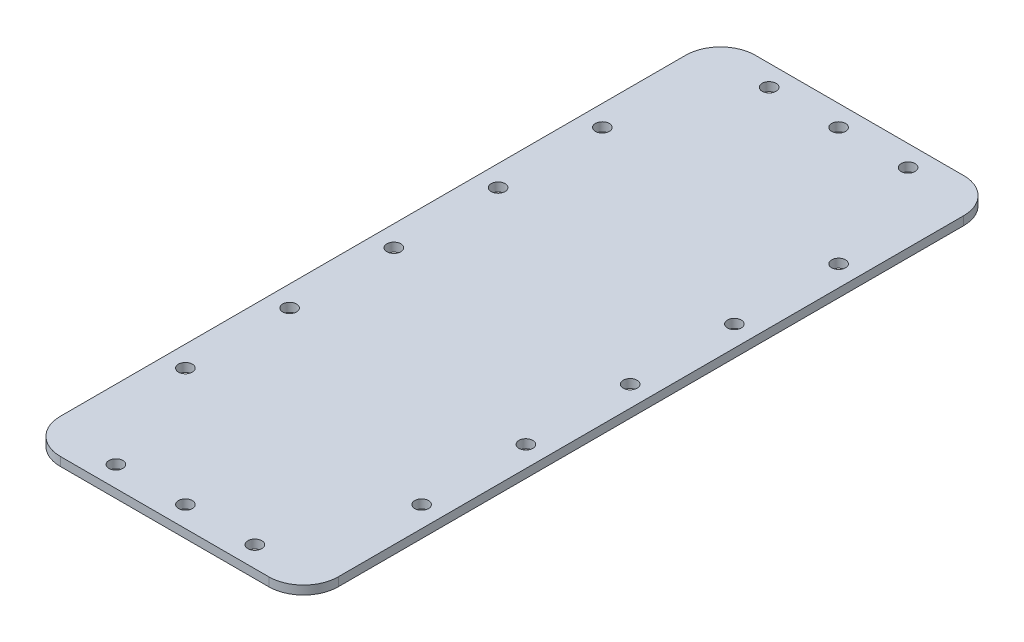
ISO-10303-21;
HEADER;
FILE_DESCRIPTION(('STEP AP214'),'2;1');
FILE_NAME('part.step','',(''),(''),'','','');
FILE_SCHEMA(('AUTOMOTIVE_DESIGN { 1 0 10303 214 1 1 1 1 }'));
ENDSEC;
DATA;
#1=APPLICATION_CONTEXT('core data for automotive mechanical design processes');
#2=APPLICATION_PROTOCOL_DEFINITION('international standard','automotive_design',2000,#1);
#3=PRODUCT_CONTEXT('',#1,'mechanical');
#4=PRODUCT('Part','Part','',(#3));
#5=PRODUCT_RELATED_PRODUCT_CATEGORY('part','',(#4));
#6=PRODUCT_DEFINITION_FORMATION('','',#4);
#7=PRODUCT_DEFINITION_CONTEXT('part definition',#1,'design');
#8=PRODUCT_DEFINITION('design','',#6,#7);
#9=PRODUCT_DEFINITION_SHAPE('','',#8);
#10=(LENGTH_UNIT() NAMED_UNIT(*) SI_UNIT(.MILLI.,.METRE.));
#11=(NAMED_UNIT(*) PLANE_ANGLE_UNIT() SI_UNIT($,.RADIAN.));
#12=(NAMED_UNIT(*) SI_UNIT($,.STERADIAN.) SOLID_ANGLE_UNIT());
#13=UNCERTAINTY_MEASURE_WITH_UNIT(LENGTH_MEASURE(1.E-05),#10,'distance_accuracy_value','');
#14=(GEOMETRIC_REPRESENTATION_CONTEXT(3) GLOBAL_UNCERTAINTY_ASSIGNED_CONTEXT((#13)) GLOBAL_UNIT_ASSIGNED_CONTEXT((#10,
#11,#12)) REPRESENTATION_CONTEXT('',''));
#15=CARTESIAN_POINT('',(0.,0.,0.));
#16=DIRECTION('',(0.,0.,1.));
#17=DIRECTION('',(1.,0.,0.));
#18=AXIS2_PLACEMENT_3D('',#15,#16,#17);
#19=CARTESIAN_POINT('',(-30.6996276411229,3.175,-42.9503076219948));
#20=DIRECTION('',(1.,0.,0.));
#21=DIRECTION('',(0.,0.,-1.));
#22=AXIS2_PLACEMENT_3D('',#19,#20,#21);
#23=PLANE('',#22);
#24=DIRECTION('',(0.,0.,1.));
#25=VECTOR('',#24,1.);
#26=CARTESIAN_POINT('',(-30.6996276411229,0.,-42.9503076219948));
#27=LINE('',#26,#25);
#28=CARTESIAN_POINT('',(-30.6996276411229,0.,-30.2503076219948));
#29=VERTEX_POINT('',#28);
#30=CARTESIAN_POINT('',(-30.6996276411228,0.,198.349692378005));
#31=VERTEX_POINT('',#30);
#32=EDGE_CURVE('E126',#29,#31,#27,.T.);
#33=ORIENTED_EDGE('',*,*,#32,.T.);
#34=DIRECTION('',(0.,-1.,0.));
#35=VECTOR('',#34,1.);
#36=CARTESIAN_POINT('',(-30.6996276411228,3.175,198.349692378005));
#37=LINE('',#36,#35);
#38=CARTESIAN_POINT('',(-30.6996276411228,3.175,198.349692378005));
#39=VERTEX_POINT('',#38);
#40=EDGE_CURVE('E104',#31,#39,#37,.F.);
#41=ORIENTED_EDGE('',*,*,#40,.T.);
#42=DIRECTION('',(0.,0.,1.));
#43=VECTOR('',#42,1.);
#44=CARTESIAN_POINT('',(-30.6996276411229,3.175,-42.9503076219948));
#45=LINE('',#44,#43);
#46=CARTESIAN_POINT('',(-30.6996276411229,3.175,-30.2503076219948));
#47=VERTEX_POINT('',#46);
#48=EDGE_CURVE('E136',#47,#39,#45,.T.);
#49=ORIENTED_EDGE('',*,*,#48,.F.);
#50=DIRECTION('',(0.,-1.,0.));
#51=VECTOR('',#50,1.);
#52=CARTESIAN_POINT('',(-30.6996276411229,3.175,-30.2503076219948));
#53=LINE('',#52,#51);
#54=EDGE_CURVE('E109',#47,#29,#53,.T.);
#55=ORIENTED_EDGE('',*,*,#54,.T.);
#56=EDGE_LOOP('',(#33,#41,#49,#55));
#57=FACE_BOUND('',#56,.T.);
#58=ADVANCED_FACE('F33',(#57),#23,.F.);
#59=CARTESIAN_POINT('',(-30.6996276411228,3.175,211.049692378005));
#60=DIRECTION('',(0.,0.,-1.));
#61=DIRECTION('',(-1.,0.,0.));
#62=AXIS2_PLACEMENT_3D('',#59,#60,#61);
#63=PLANE('',#62);
#64=DIRECTION('',(1.,0.,0.));
#65=VECTOR('',#64,1.);
#66=CARTESIAN_POINT('',(-30.6996276411228,3.175,211.049692378005));
#67=LINE('',#66,#65);
#68=CARTESIAN_POINT('',(-17.9996276411228,3.175,211.049692378005));
#69=VERTEX_POINT('',#68);
#70=CARTESIAN_POINT('',(58.2003723588771,3.175,211.049692378005));
#71=VERTEX_POINT('',#70);
#72=EDGE_CURVE('E119',#69,#71,#67,.T.);
#73=ORIENTED_EDGE('',*,*,#72,.F.);
#74=DIRECTION('',(0.,-1.,0.));
#75=VECTOR('',#74,1.);
#76=CARTESIAN_POINT('',(-17.9996276411228,3.175,211.049692378005));
#77=LINE('',#76,#75);
#78=CARTESIAN_POINT('',(-17.9996276411228,0.,211.049692378005));
#79=VERTEX_POINT('',#78);
#80=EDGE_CURVE('E103',#69,#79,#77,.T.);
#81=ORIENTED_EDGE('',*,*,#80,.T.);
#82=DIRECTION('',(1.,0.,0.));
#83=VECTOR('',#82,1.);
#84=CARTESIAN_POINT('',(-30.6996276411228,0.,211.049692378005));
#85=LINE('',#84,#83);
#86=CARTESIAN_POINT('',(58.2003723588771,0.,211.049692378005));
#87=VERTEX_POINT('',#86);
#88=EDGE_CURVE('E116',#79,#87,#85,.T.);
#89=ORIENTED_EDGE('',*,*,#88,.T.);
#90=DIRECTION('',(0.,-1.,0.));
#91=VECTOR('',#90,1.);
#92=CARTESIAN_POINT('',(58.2003723588771,3.175,211.049692378005));
#93=LINE('',#92,#91);
#94=EDGE_CURVE('E121',#87,#71,#93,.F.);
#95=ORIENTED_EDGE('',*,*,#94,.T.);
#96=EDGE_LOOP('',(#73,#81,#89,#95));
#97=FACE_BOUND('',#96,.T.);
#98=ADVANCED_FACE('F115',(#97),#63,.F.);
#99=CARTESIAN_POINT('',(70.9003723588771,3.175,-42.9503076219948));
#100=DIRECTION('',(-1.,0.,0.));
#101=DIRECTION('',(0.,0.,1.));
#102=AXIS2_PLACEMENT_3D('',#99,#100,#101);
#103=PLANE('',#102);
#104=DIRECTION('',(0.,0.,-1.));
#105=VECTOR('',#104,1.);
#106=CARTESIAN_POINT('',(70.9003723588771,3.175,-42.9503076219948));
#107=LINE('',#106,#105);
#108=CARTESIAN_POINT('',(70.9003723588771,3.175,198.349692378005));
#109=VERTEX_POINT('',#108);
#110=CARTESIAN_POINT('',(70.9003723588771,3.175,-30.2503076219948));
#111=VERTEX_POINT('',#110);
#112=EDGE_CURVE('E162',#109,#111,#107,.T.);
#113=ORIENTED_EDGE('',*,*,#112,.F.);
#114=DIRECTION('',(0.,-1.,0.));
#115=VECTOR('',#114,1.);
#116=CARTESIAN_POINT('',(70.9003723588771,3.175,198.349692378005));
#117=LINE('',#116,#115);
#118=CARTESIAN_POINT('',(70.9003723588771,0.,198.349692378005));
#119=VERTEX_POINT('',#118);
#120=EDGE_CURVE('E155',#109,#119,#117,.T.);
#121=ORIENTED_EDGE('',*,*,#120,.T.);
#122=DIRECTION('',(0.,0.,-1.));
#123=VECTOR('',#122,1.);
#124=CARTESIAN_POINT('',(70.9003723588771,0.,-42.9503076219948));
#125=LINE('',#124,#123);
#126=CARTESIAN_POINT('',(70.9003723588771,0.,-30.2503076219948));
#127=VERTEX_POINT('',#126);
#128=EDGE_CURVE('E125',#119,#127,#125,.T.);
#129=ORIENTED_EDGE('',*,*,#128,.T.);
#130=DIRECTION('',(0.,-1.,0.));
#131=VECTOR('',#130,1.);
#132=CARTESIAN_POINT('',(70.9003723588771,3.175,-30.2503076219948));
#133=LINE('',#132,#131);
#134=EDGE_CURVE('E153',#127,#111,#133,.F.);
#135=ORIENTED_EDGE('',*,*,#134,.T.);
#136=EDGE_LOOP('',(#113,#121,#129,#135));
#137=FACE_BOUND('',#136,.T.);
#138=ADVANCED_FACE('F160',(#137),#103,.F.);
#139=CARTESIAN_POINT('',(-30.6996276411229,3.175,-42.9503076219948));
#140=DIRECTION('',(0.,0.,1.));
#141=DIRECTION('',(1.,0.,0.));
#142=AXIS2_PLACEMENT_3D('',#139,#140,#141);
#143=PLANE('',#142);
#144=DIRECTION('',(-1.,0.,0.));
#145=VECTOR('',#144,1.);
#146=CARTESIAN_POINT('',(-30.6996276411229,3.175,-42.9503076219948));
#147=LINE('',#146,#145);
#148=CARTESIAN_POINT('',(58.2003723588771,3.175,-42.9503076219948));
#149=VERTEX_POINT('',#148);
#150=CARTESIAN_POINT('',(-17.9996276411229,3.175,-42.9503076219948));
#151=VERTEX_POINT('',#150);
#152=EDGE_CURVE('E137',#149,#151,#147,.T.);
#153=ORIENTED_EDGE('',*,*,#152,.F.);
#154=DIRECTION('',(0.,-1.,0.));
#155=VECTOR('',#154,1.);
#156=CARTESIAN_POINT('',(58.2003723588771,3.175,-42.9503076219948));
#157=LINE('',#156,#155);
#158=CARTESIAN_POINT('',(58.2003723588771,0.,-42.9503076219948));
#159=VERTEX_POINT('',#158);
#160=EDGE_CURVE('E11',#149,#159,#157,.T.);
#161=ORIENTED_EDGE('',*,*,#160,.T.);
#162=DIRECTION('',(-1.,0.,0.));
#163=VECTOR('',#162,1.);
#164=CARTESIAN_POINT('',(-30.6996276411229,0.,-42.9503076219948));
#165=LINE('',#164,#163);
#166=CARTESIAN_POINT('',(-17.9996276411229,0.,-42.9503076219948));
#167=VERTEX_POINT('',#166);
#168=EDGE_CURVE('E129',#159,#167,#165,.T.);
#169=ORIENTED_EDGE('',*,*,#168,.T.);
#170=DIRECTION('',(0.,-1.,0.));
#171=VECTOR('',#170,1.);
#172=CARTESIAN_POINT('',(-17.9996276411229,3.175,-42.9503076219948));
#173=LINE('',#172,#171);
#174=EDGE_CURVE('E41',#167,#151,#173,.F.);
#175=ORIENTED_EDGE('',*,*,#174,.T.);
#176=EDGE_LOOP('',(#153,#161,#169,#175));
#177=FACE_BOUND('',#176,.T.);
#178=ADVANCED_FACE('F169',(#177),#143,.F.);
#179=CARTESIAN_POINT('',(0.,3.175,0.));
#180=DIRECTION('',(0.,1.,0.));
#181=DIRECTION('',(0.,0.,1.));
#182=AXIS2_PLACEMENT_3D('',#179,#180,#181);
#183=PLANE('',#182);
#184=CARTESIAN_POINT('',(-5.29962764112285,3.175,203.429692378005));
#185=DIRECTION('',(0.,1.,0.));
#186=DIRECTION('',(0.,0.,-1.));
#187=AXIS2_PLACEMENT_3D('',#184,#185,#186);
#188=CIRCLE('',#187,2.54000000000001);
#189=CARTESIAN_POINT('',(-5.29962764112285,3.175,200.889692378005));
#190=VERTEX_POINT('',#189);
#191=EDGE_CURVE('E182',#190,#190,#188,.T.);
#192=ORIENTED_EDGE('',*,*,#191,.F.);
#193=EDGE_LOOP('',(#192));
#194=FACE_BOUND('',#193,.T.);
#195=CARTESIAN_POINT('',(20.1003723588771,3.175,203.429692378005));
#196=DIRECTION('',(0.,1.,0.));
#197=DIRECTION('',(0.,0.,-1.));
#198=AXIS2_PLACEMENT_3D('',#195,#196,#197);
#199=CIRCLE('',#198,2.54000000000001);
#200=CARTESIAN_POINT('',(20.1003723588771,3.175,200.889692378005));
#201=VERTEX_POINT('',#200);
#202=EDGE_CURVE('E188',#201,#201,#199,.T.);
#203=ORIENTED_EDGE('',*,*,#202,.F.);
#204=EDGE_LOOP('',(#203));
#205=FACE_BOUND('',#204,.T.);
#206=CARTESIAN_POINT('',(45.5003723588772,3.175,203.429692378005));
#207=DIRECTION('',(0.,1.,0.));
#208=DIRECTION('',(0.,0.,-1.));
#209=AXIS2_PLACEMENT_3D('',#206,#207,#208);
#210=CIRCLE('',#209,2.54000000000001);
#211=CARTESIAN_POINT('',(45.5003723588772,3.175,200.889692378005));
#212=VERTEX_POINT('',#211);
#213=EDGE_CURVE('E194',#212,#212,#210,.T.);
#214=ORIENTED_EDGE('',*,*,#213,.F.);
#215=EDGE_LOOP('',(#214));
#216=FACE_BOUND('',#215,.T.);
#217=CARTESIAN_POINT('',(-23.0796276411229,3.175,122.149692378005));
#218=DIRECTION('',(0.,1.,0.));
#219=DIRECTION('',(0.,0.,-1.));
#220=AXIS2_PLACEMENT_3D('',#217,#218,#219);
#221=CIRCLE('',#220,2.54);
#222=CARTESIAN_POINT('',(-23.0796276411229,3.175,119.609692378005));
#223=VERTEX_POINT('',#222);
#224=EDGE_CURVE('E200',#223,#223,#221,.T.);
#225=ORIENTED_EDGE('',*,*,#224,.F.);
#226=EDGE_LOOP('',(#225));
#227=FACE_BOUND('',#226,.T.);
#228=CARTESIAN_POINT('',(-23.0796276411229,3.175,160.249692378005));
#229=DIRECTION('',(0.,1.,0.));
#230=DIRECTION('',(0.,0.,-1.));
#231=AXIS2_PLACEMENT_3D('',#228,#229,#230);
#232=CIRCLE('',#231,2.54);
#233=CARTESIAN_POINT('',(-23.0796276411229,3.175,157.709692378005));
#234=VERTEX_POINT('',#233);
#235=EDGE_CURVE('E206',#234,#234,#232,.T.);
#236=ORIENTED_EDGE('',*,*,#235,.F.);
#237=EDGE_LOOP('',(#236));
#238=FACE_BOUND('',#237,.T.);
#239=CARTESIAN_POINT('',(63.2803723588772,3.175,160.249692378005));
#240=DIRECTION('',(0.,1.,0.));
#241=DIRECTION('',(0.,0.,1.));
#242=AXIS2_PLACEMENT_3D('',#239,#240,#241);
#243=CIRCLE('',#242,2.54);
#244=CARTESIAN_POINT('',(63.2803723588772,3.175,162.789692378005));
#245=VERTEX_POINT('',#244);
#246=EDGE_CURVE('E212',#245,#245,#243,.T.);
#247=ORIENTED_EDGE('',*,*,#246,.F.);
#248=EDGE_LOOP('',(#247));
#249=FACE_BOUND('',#248,.T.);
#250=CARTESIAN_POINT('',(63.2803723588771,3.175,122.149692378005));
#251=DIRECTION('',(0.,1.,0.));
#252=DIRECTION('',(0.,0.,1.));
#253=AXIS2_PLACEMENT_3D('',#250,#251,#252);
#254=CIRCLE('',#253,2.53999999999999);
#255=CARTESIAN_POINT('',(63.2803723588771,3.175,124.689692378005));
#256=VERTEX_POINT('',#255);
#257=EDGE_CURVE('E218',#256,#256,#254,.T.);
#258=ORIENTED_EDGE('',*,*,#257,.F.);
#259=EDGE_LOOP('',(#258));
#260=FACE_BOUND('',#259,.T.);
#261=CARTESIAN_POINT('',(20.1003723588771,3.175,-35.3303076219948));
#262=DIRECTION('',(0.,1.,0.));
#263=DIRECTION('',(0.,0.,1.));
#264=AXIS2_PLACEMENT_3D('',#261,#262,#263);
#265=CIRCLE('',#264,2.54);
#266=CARTESIAN_POINT('',(20.1003723588771,3.175,-32.7903076219948));
#267=VERTEX_POINT('',#266);
#268=EDGE_CURVE('E244',#267,#267,#265,.T.);
#269=ORIENTED_EDGE('',*,*,#268,.F.);
#270=EDGE_LOOP('',(#269));
#271=FACE_BOUND('',#270,.T.);
#272=CARTESIAN_POINT('',(45.5003723588771,3.175,-35.3303076219948));
#273=DIRECTION('',(0.,1.,0.));
#274=DIRECTION('',(0.,0.,1.));
#275=AXIS2_PLACEMENT_3D('',#272,#273,#274);
#276=CIRCLE('',#275,2.54);
#277=CARTESIAN_POINT('',(45.5003723588771,3.175,-32.7903076219948));
#278=VERTEX_POINT('',#277);
#279=EDGE_CURVE('E238',#278,#278,#276,.T.);
#280=ORIENTED_EDGE('',*,*,#279,.F.);
#281=EDGE_LOOP('',(#280));
#282=FACE_BOUND('',#281,.T.);
#283=CARTESIAN_POINT('',(-23.0796276411229,3.175,84.0496923780052));
#284=DIRECTION('',(0.,1.,0.));
#285=DIRECTION('',(0.,0.,1.));
#286=AXIS2_PLACEMENT_3D('',#283,#284,#285);
#287=CIRCLE('',#286,2.53999999999999);
#288=CARTESIAN_POINT('',(-23.0796276411229,3.175,86.5896923780052));
#289=VERTEX_POINT('',#288);
#290=EDGE_CURVE('E232',#289,#289,#287,.T.);
#291=ORIENTED_EDGE('',*,*,#290,.F.);
#292=EDGE_LOOP('',(#291));
#293=FACE_BOUND('',#292,.T.);
#294=CARTESIAN_POINT('',(-23.0796276411229,3.175,45.9496923780052));
#295=DIRECTION('',(0.,1.,0.));
#296=DIRECTION('',(0.,0.,1.));
#297=AXIS2_PLACEMENT_3D('',#294,#295,#296);
#298=CIRCLE('',#297,2.54);
#299=CARTESIAN_POINT('',(-23.0796276411229,3.175,48.4896923780052));
#300=VERTEX_POINT('',#299);
#301=EDGE_CURVE('E225',#300,#300,#298,.T.);
#302=ORIENTED_EDGE('',*,*,#301,.F.);
#303=EDGE_LOOP('',(#302));
#304=FACE_BOUND('',#303,.T.);
#305=CARTESIAN_POINT('',(-23.0796276411229,3.175,7.8496923780052));
#306=DIRECTION('',(0.,1.,0.));
#307=DIRECTION('',(0.,0.,1.));
#308=AXIS2_PLACEMENT_3D('',#305,#306,#307);
#309=CIRCLE('',#308,2.54);
#310=CARTESIAN_POINT('',(-23.0796276411229,3.175,10.3896923780052));
#311=VERTEX_POINT('',#310);
#312=EDGE_CURVE('E266',#311,#311,#309,.T.);
#313=ORIENTED_EDGE('',*,*,#312,.F.);
#314=EDGE_LOOP('',(#313));
#315=FACE_BOUND('',#314,.T.);
#316=CARTESIAN_POINT('',(63.2803723588771,3.175,7.84969237800519));
#317=DIRECTION('',(0.,1.,0.));
#318=DIRECTION('',(0.,0.,-1.));
#319=AXIS2_PLACEMENT_3D('',#316,#317,#318);
#320=CIRCLE('',#319,2.54);
#321=CARTESIAN_POINT('',(63.2803723588771,3.175,5.3096923780052));
#322=VERTEX_POINT('',#321);
#323=EDGE_CURVE('E260',#322,#322,#320,.T.);
#324=ORIENTED_EDGE('',*,*,#323,.F.);
#325=EDGE_LOOP('',(#324));
#326=FACE_BOUND('',#325,.T.);
#327=CARTESIAN_POINT('',(63.2803723588771,3.175,45.9496923780052));
#328=DIRECTION('',(0.,1.,0.));
#329=DIRECTION('',(0.,0.,-1.));
#330=AXIS2_PLACEMENT_3D('',#327,#328,#329);
#331=CIRCLE('',#330,2.54);
#332=CARTESIAN_POINT('',(63.2803723588771,3.175,43.4096923780052));
#333=VERTEX_POINT('',#332);
#334=EDGE_CURVE('E254',#333,#333,#331,.T.);
#335=ORIENTED_EDGE('',*,*,#334,.F.);
#336=EDGE_LOOP('',(#335));
#337=FACE_BOUND('',#336,.T.);
#338=CARTESIAN_POINT('',(63.2803723588771,3.175,84.0496923780052));
#339=DIRECTION('',(0.,1.,0.));
#340=DIRECTION('',(0.,0.,-1.));
#341=AXIS2_PLACEMENT_3D('',#338,#339,#340);
#342=CIRCLE('',#341,2.53999999999999);
#343=CARTESIAN_POINT('',(63.2803723588771,3.175,81.5096923780052));
#344=VERTEX_POINT('',#343);
#345=EDGE_CURVE('E224',#344,#344,#342,.T.);
#346=ORIENTED_EDGE('',*,*,#345,.F.);
#347=EDGE_LOOP('',(#346));
#348=FACE_BOUND('',#347,.T.);
#349=CARTESIAN_POINT('',(-5.29962764112289,3.175,-35.3303076219948));
#350=DIRECTION('',(0.,1.,0.));
#351=DIRECTION('',(0.,0.,1.));
#352=AXIS2_PLACEMENT_3D('',#349,#350,#351);
#353=CIRCLE('',#352,2.54);
#354=CARTESIAN_POINT('',(-5.29962764112289,3.175,-32.7903076219948));
#355=VERTEX_POINT('',#354);
#356=EDGE_CURVE('E176',#355,#355,#353,.T.);
#357=ORIENTED_EDGE('',*,*,#356,.F.);
#358=EDGE_LOOP('',(#357));
#359=FACE_BOUND('',#358,.T.);
#360=ORIENTED_EDGE('',*,*,#48,.T.);
#361=CARTESIAN_POINT('',(-17.9996276411228,3.175,198.349692378005));
#362=DIRECTION('',(0.,1.,0.));
#363=DIRECTION('',(0.,0.,1.));
#364=AXIS2_PLACEMENT_3D('',#361,#362,#363);
#365=CIRCLE('',#364,12.7);
#366=EDGE_CURVE('E151',#39,#69,#365,.T.);
#367=ORIENTED_EDGE('',*,*,#366,.T.);
#368=ORIENTED_EDGE('',*,*,#72,.T.);
#369=CARTESIAN_POINT('',(58.2003723588771,3.175,198.349692378005));
#370=DIRECTION('',(0.,1.,0.));
#371=DIRECTION('',(0.,0.,1.));
#372=AXIS2_PLACEMENT_3D('',#369,#370,#371);
#373=CIRCLE('',#372,12.7);
#374=EDGE_CURVE('E149',#71,#109,#373,.T.);
#375=ORIENTED_EDGE('',*,*,#374,.T.);
#376=ORIENTED_EDGE('',*,*,#112,.T.);
#377=CARTESIAN_POINT('',(58.2003723588771,3.175,-30.2503076219948));
#378=DIRECTION('',(0.,1.,0.));
#379=DIRECTION('',(0.,0.,1.));
#380=AXIS2_PLACEMENT_3D('',#377,#378,#379);
#381=CIRCLE('',#380,12.7);
#382=EDGE_CURVE('E54',#111,#149,#381,.T.);
#383=ORIENTED_EDGE('',*,*,#382,.T.);
#384=ORIENTED_EDGE('',*,*,#152,.T.);
#385=CARTESIAN_POINT('',(-17.9996276411229,3.175,-30.2503076219948));
#386=DIRECTION('',(0.,1.,0.));
#387=DIRECTION('',(0.,0.,1.));
#388=AXIS2_PLACEMENT_3D('',#385,#386,#387);
#389=CIRCLE('',#388,12.7);
#390=EDGE_CURVE('E146',#151,#47,#389,.T.);
#391=ORIENTED_EDGE('',*,*,#390,.T.);
#392=EDGE_LOOP('',(#360,#367,#368,#375,#376,#383,#384,#391));
#393=FACE_BOUND('',#392,.T.);
#394=ADVANCED_FACE('F282',(#194,#205,#216,#227,#238,#249,#260,#271,#282,#293,#304,#315,#326,
#337,#348,#359,#393),#183,.T.);
#395=CARTESIAN_POINT('',(0.,0.,0.));
#396=DIRECTION('',(0.,1.,0.));
#397=DIRECTION('',(0.,0.,1.));
#398=AXIS2_PLACEMENT_3D('',#395,#396,#397);
#399=PLANE('',#398);
#400=CARTESIAN_POINT('',(-5.29962764112285,0.,203.429692378005));
#401=DIRECTION('',(0.,1.,0.));
#402=DIRECTION('',(0.,0.,-1.));
#403=AXIS2_PLACEMENT_3D('',#400,#401,#402);
#404=CIRCLE('',#403,2.54000000000001);
#405=CARTESIAN_POINT('',(-5.29962764112285,0.,200.889692378005));
#406=VERTEX_POINT('',#405);
#407=EDGE_CURVE('E185',#406,#406,#404,.T.);
#408=ORIENTED_EDGE('',*,*,#407,.T.);
#409=EDGE_LOOP('',(#408));
#410=FACE_BOUND('',#409,.T.);
#411=CARTESIAN_POINT('',(20.1003723588771,0.,203.429692378005));
#412=DIRECTION('',(0.,1.,0.));
#413=DIRECTION('',(0.,0.,-1.));
#414=AXIS2_PLACEMENT_3D('',#411,#412,#413);
#415=CIRCLE('',#414,2.54000000000001);
#416=CARTESIAN_POINT('',(20.1003723588771,0.,200.889692378005));
#417=VERTEX_POINT('',#416);
#418=EDGE_CURVE('E191',#417,#417,#415,.T.);
#419=ORIENTED_EDGE('',*,*,#418,.T.);
#420=EDGE_LOOP('',(#419));
#421=FACE_BOUND('',#420,.T.);
#422=CARTESIAN_POINT('',(45.5003723588772,0.,203.429692378005));
#423=DIRECTION('',(0.,1.,0.));
#424=DIRECTION('',(0.,0.,-1.));
#425=AXIS2_PLACEMENT_3D('',#422,#423,#424);
#426=CIRCLE('',#425,2.54000000000001);
#427=CARTESIAN_POINT('',(45.5003723588772,0.,200.889692378005));
#428=VERTEX_POINT('',#427);
#429=EDGE_CURVE('E197',#428,#428,#426,.T.);
#430=ORIENTED_EDGE('',*,*,#429,.T.);
#431=EDGE_LOOP('',(#430));
#432=FACE_BOUND('',#431,.T.);
#433=CARTESIAN_POINT('',(-23.0796276411229,0.,122.149692378005));
#434=DIRECTION('',(0.,1.,0.));
#435=DIRECTION('',(0.,0.,-1.));
#436=AXIS2_PLACEMENT_3D('',#433,#434,#435);
#437=CIRCLE('',#436,2.54);
#438=CARTESIAN_POINT('',(-23.0796276411229,0.,119.609692378005));
#439=VERTEX_POINT('',#438);
#440=EDGE_CURVE('E203',#439,#439,#437,.T.);
#441=ORIENTED_EDGE('',*,*,#440,.T.);
#442=EDGE_LOOP('',(#441));
#443=FACE_BOUND('',#442,.T.);
#444=CARTESIAN_POINT('',(-23.0796276411229,0.,160.249692378005));
#445=DIRECTION('',(0.,1.,0.));
#446=DIRECTION('',(0.,0.,-1.));
#447=AXIS2_PLACEMENT_3D('',#444,#445,#446);
#448=CIRCLE('',#447,2.54);
#449=CARTESIAN_POINT('',(-23.0796276411229,0.,157.709692378005));
#450=VERTEX_POINT('',#449);
#451=EDGE_CURVE('E209',#450,#450,#448,.T.);
#452=ORIENTED_EDGE('',*,*,#451,.T.);
#453=EDGE_LOOP('',(#452));
#454=FACE_BOUND('',#453,.T.);
#455=CARTESIAN_POINT('',(63.2803723588772,0.,160.249692378005));
#456=DIRECTION('',(0.,1.,0.));
#457=DIRECTION('',(0.,0.,1.));
#458=AXIS2_PLACEMENT_3D('',#455,#456,#457);
#459=CIRCLE('',#458,2.54);
#460=CARTESIAN_POINT('',(63.2803723588772,0.,162.789692378005));
#461=VERTEX_POINT('',#460);
#462=EDGE_CURVE('E215',#461,#461,#459,.T.);
#463=ORIENTED_EDGE('',*,*,#462,.T.);
#464=EDGE_LOOP('',(#463));
#465=FACE_BOUND('',#464,.T.);
#466=CARTESIAN_POINT('',(63.2803723588771,0.,122.149692378005));
#467=DIRECTION('',(0.,1.,0.));
#468=DIRECTION('',(0.,0.,1.));
#469=AXIS2_PLACEMENT_3D('',#466,#467,#468);
#470=CIRCLE('',#469,2.53999999999999);
#471=CARTESIAN_POINT('',(63.2803723588771,0.,124.689692378005));
#472=VERTEX_POINT('',#471);
#473=EDGE_CURVE('E221',#472,#472,#470,.T.);
#474=ORIENTED_EDGE('',*,*,#473,.T.);
#475=EDGE_LOOP('',(#474));
#476=FACE_BOUND('',#475,.T.);
#477=CARTESIAN_POINT('',(20.1003723588771,0.,-35.3303076219948));
#478=DIRECTION('',(0.,1.,0.));
#479=DIRECTION('',(0.,0.,1.));
#480=AXIS2_PLACEMENT_3D('',#477,#478,#479);
#481=CIRCLE('',#480,2.54);
#482=CARTESIAN_POINT('',(20.1003723588771,0.,-32.7903076219948));
#483=VERTEX_POINT('',#482);
#484=EDGE_CURVE('E179',#483,#483,#481,.T.);
#485=ORIENTED_EDGE('',*,*,#484,.T.);
#486=EDGE_LOOP('',(#485));
#487=FACE_BOUND('',#486,.T.);
#488=CARTESIAN_POINT('',(45.5003723588771,0.,-35.3303076219948));
#489=DIRECTION('',(0.,1.,0.));
#490=DIRECTION('',(0.,0.,1.));
#491=AXIS2_PLACEMENT_3D('',#488,#489,#490);
#492=CIRCLE('',#491,2.54);
#493=CARTESIAN_POINT('',(45.5003723588771,0.,-32.7903076219948));
#494=VERTEX_POINT('',#493);
#495=EDGE_CURVE('E241',#494,#494,#492,.T.);
#496=ORIENTED_EDGE('',*,*,#495,.T.);
#497=EDGE_LOOP('',(#496));
#498=FACE_BOUND('',#497,.T.);
#499=CARTESIAN_POINT('',(-23.0796276411229,0.,84.0496923780052));
#500=DIRECTION('',(0.,1.,0.));
#501=DIRECTION('',(0.,0.,1.));
#502=AXIS2_PLACEMENT_3D('',#499,#500,#501);
#503=CIRCLE('',#502,2.53999999999999);
#504=CARTESIAN_POINT('',(-23.0796276411229,0.,86.5896923780052));
#505=VERTEX_POINT('',#504);
#506=EDGE_CURVE('E235',#505,#505,#503,.T.);
#507=ORIENTED_EDGE('',*,*,#506,.T.);
#508=EDGE_LOOP('',(#507));
#509=FACE_BOUND('',#508,.T.);
#510=CARTESIAN_POINT('',(-23.0796276411229,0.,45.9496923780052));
#511=DIRECTION('',(0.,1.,0.));
#512=DIRECTION('',(0.,0.,1.));
#513=AXIS2_PLACEMENT_3D('',#510,#511,#512);
#514=CIRCLE('',#513,2.54);
#515=CARTESIAN_POINT('',(-23.0796276411229,0.,48.4896923780052));
#516=VERTEX_POINT('',#515);
#517=EDGE_CURVE('E228',#516,#516,#514,.T.);
#518=ORIENTED_EDGE('',*,*,#517,.T.);
#519=EDGE_LOOP('',(#518));
#520=FACE_BOUND('',#519,.T.);
#521=CARTESIAN_POINT('',(-23.0796276411229,0.,7.8496923780052));
#522=DIRECTION('',(0.,1.,0.));
#523=DIRECTION('',(0.,0.,1.));
#524=AXIS2_PLACEMENT_3D('',#521,#522,#523);
#525=CIRCLE('',#524,2.54);
#526=CARTESIAN_POINT('',(-23.0796276411229,0.,10.3896923780052));
#527=VERTEX_POINT('',#526);
#528=EDGE_CURVE('E229',#527,#527,#525,.T.);
#529=ORIENTED_EDGE('',*,*,#528,.T.);
#530=EDGE_LOOP('',(#529));
#531=FACE_BOUND('',#530,.T.);
#532=CARTESIAN_POINT('',(63.2803723588771,0.,7.84969237800519));
#533=DIRECTION('',(0.,1.,0.));
#534=DIRECTION('',(0.,0.,-1.));
#535=AXIS2_PLACEMENT_3D('',#532,#533,#534);
#536=CIRCLE('',#535,2.54);
#537=CARTESIAN_POINT('',(63.2803723588771,0.,5.3096923780052));
#538=VERTEX_POINT('',#537);
#539=EDGE_CURVE('E263',#538,#538,#536,.T.);
#540=ORIENTED_EDGE('',*,*,#539,.T.);
#541=EDGE_LOOP('',(#540));
#542=FACE_BOUND('',#541,.T.);
#543=CARTESIAN_POINT('',(63.2803723588771,0.,45.9496923780052));
#544=DIRECTION('',(0.,1.,0.));
#545=DIRECTION('',(0.,0.,-1.));
#546=AXIS2_PLACEMENT_3D('',#543,#544,#545);
#547=CIRCLE('',#546,2.54);
#548=CARTESIAN_POINT('',(63.2803723588771,0.,43.4096923780052));
#549=VERTEX_POINT('',#548);
#550=EDGE_CURVE('E257',#549,#549,#547,.T.);
#551=ORIENTED_EDGE('',*,*,#550,.T.);
#552=EDGE_LOOP('',(#551));
#553=FACE_BOUND('',#552,.T.);
#554=CARTESIAN_POINT('',(63.2803723588771,0.,84.0496923780052));
#555=DIRECTION('',(0.,1.,0.));
#556=DIRECTION('',(0.,0.,-1.));
#557=AXIS2_PLACEMENT_3D('',#554,#555,#556);
#558=CIRCLE('',#557,2.53999999999999);
#559=CARTESIAN_POINT('',(63.2803723588771,0.,81.5096923780052));
#560=VERTEX_POINT('',#559);
#561=EDGE_CURVE('E251',#560,#560,#558,.T.);
#562=ORIENTED_EDGE('',*,*,#561,.T.);
#563=EDGE_LOOP('',(#562));
#564=FACE_BOUND('',#563,.T.);
#565=CARTESIAN_POINT('',(-5.29962764112289,0.,-35.3303076219948));
#566=DIRECTION('',(0.,1.,0.));
#567=DIRECTION('',(0.,0.,1.));
#568=AXIS2_PLACEMENT_3D('',#565,#566,#567);
#569=CIRCLE('',#568,2.54);
#570=CARTESIAN_POINT('',(-5.29962764112289,0.,-32.7903076219948));
#571=VERTEX_POINT('',#570);
#572=EDGE_CURVE('E131',#571,#571,#569,.T.);
#573=ORIENTED_EDGE('',*,*,#572,.T.);
#574=EDGE_LOOP('',(#573));
#575=FACE_BOUND('',#574,.T.);
#576=ORIENTED_EDGE('',*,*,#88,.F.);
#577=CARTESIAN_POINT('',(-17.9996276411228,0.,198.349692378005));
#578=DIRECTION('',(0.,1.,0.));
#579=DIRECTION('',(0.,0.,1.));
#580=AXIS2_PLACEMENT_3D('',#577,#578,#579);
#581=CIRCLE('',#580,12.7);
#582=EDGE_CURVE('E99',#79,#31,#581,.F.);
#583=ORIENTED_EDGE('',*,*,#582,.T.);
#584=ORIENTED_EDGE('',*,*,#32,.F.);
#585=CARTESIAN_POINT('',(-17.9996276411229,0.,-30.2503076219948));
#586=DIRECTION('',(0.,1.,0.));
#587=DIRECTION('',(0.,0.,1.));
#588=AXIS2_PLACEMENT_3D('',#585,#586,#587);
#589=CIRCLE('',#588,12.7);
#590=EDGE_CURVE('E120',#29,#167,#589,.F.);
#591=ORIENTED_EDGE('',*,*,#590,.T.);
#592=ORIENTED_EDGE('',*,*,#168,.F.);
#593=CARTESIAN_POINT('',(58.2003723588771,0.,-30.2503076219948));
#594=DIRECTION('',(0.,1.,0.));
#595=DIRECTION('',(0.,0.,1.));
#596=AXIS2_PLACEMENT_3D('',#593,#594,#595);
#597=CIRCLE('',#596,12.7);
#598=EDGE_CURVE('E140',#159,#127,#597,.F.);
#599=ORIENTED_EDGE('',*,*,#598,.T.);
#600=ORIENTED_EDGE('',*,*,#128,.F.);
#601=CARTESIAN_POINT('',(58.2003723588771,0.,198.349692378005));
#602=DIRECTION('',(0.,1.,0.));
#603=DIRECTION('',(0.,0.,1.));
#604=AXIS2_PLACEMENT_3D('',#601,#602,#603);
#605=CIRCLE('',#604,12.7);
#606=EDGE_CURVE('E110',#119,#87,#605,.F.);
#607=ORIENTED_EDGE('',*,*,#606,.T.);
#608=EDGE_LOOP('',(#576,#583,#584,#591,#592,#599,#600,#607));
#609=FACE_BOUND('',#608,.T.);
#610=ADVANCED_FACE('F123',(#410,#421,#432,#443,#454,#465,#476,#487,#498,#509,#520,#531,#542,
#553,#564,#575,#609),#399,.F.);
#611=CARTESIAN_POINT('',(-5.29962764112289,0.,-35.3303076219948));
#612=DIRECTION('',(0.,1.,0.));
#613=DIRECTION('',(0.,0.,1.));
#614=AXIS2_PLACEMENT_3D('',#611,#612,#613);
#615=CYLINDRICAL_SURFACE('',#614,2.54);
#616=ORIENTED_EDGE('',*,*,#572,.F.);
#617=EDGE_LOOP('',(#616));
#618=FACE_BOUND('',#617,.T.);
#619=ORIENTED_EDGE('',*,*,#356,.T.);
#620=EDGE_LOOP('',(#619));
#621=FACE_BOUND('',#620,.T.);
#622=ADVANCED_FACE('F464',(#618,#621),#615,.F.);
#623=CARTESIAN_POINT('',(63.2803723588771,0.,84.0496923780052));
#624=DIRECTION('',(0.,1.,0.));
#625=DIRECTION('',(0.,0.,1.));
#626=AXIS2_PLACEMENT_3D('',#623,#624,#625);
#627=CYLINDRICAL_SURFACE('',#626,2.53999999999999);
#628=ORIENTED_EDGE('',*,*,#561,.F.);
#629=EDGE_LOOP('',(#628));
#630=FACE_BOUND('',#629,.T.);
#631=ORIENTED_EDGE('',*,*,#345,.T.);
#632=EDGE_LOOP('',(#631));
#633=FACE_BOUND('',#632,.T.);
#634=ADVANCED_FACE('F455',(#630,#633),#627,.F.);
#635=CARTESIAN_POINT('',(63.2803723588771,0.,45.9496923780052));
#636=DIRECTION('',(0.,1.,0.));
#637=DIRECTION('',(0.,0.,1.));
#638=AXIS2_PLACEMENT_3D('',#635,#636,#637);
#639=CYLINDRICAL_SURFACE('',#638,2.54);
#640=ORIENTED_EDGE('',*,*,#550,.F.);
#641=EDGE_LOOP('',(#640));
#642=FACE_BOUND('',#641,.T.);
#643=ORIENTED_EDGE('',*,*,#334,.T.);
#644=EDGE_LOOP('',(#643));
#645=FACE_BOUND('',#644,.T.);
#646=ADVANCED_FACE('F446',(#642,#645),#639,.F.);
#647=CARTESIAN_POINT('',(63.2803723588771,0.,7.84969237800519));
#648=DIRECTION('',(0.,1.,0.));
#649=DIRECTION('',(0.,0.,1.));
#650=AXIS2_PLACEMENT_3D('',#647,#648,#649);
#651=CYLINDRICAL_SURFACE('',#650,2.54);
#652=ORIENTED_EDGE('',*,*,#539,.F.);
#653=EDGE_LOOP('',(#652));
#654=FACE_BOUND('',#653,.T.);
#655=ORIENTED_EDGE('',*,*,#323,.T.);
#656=EDGE_LOOP('',(#655));
#657=FACE_BOUND('',#656,.T.);
#658=ADVANCED_FACE('F278',(#654,#657),#651,.F.);
#659=CARTESIAN_POINT('',(-23.0796276411229,0.,7.8496923780052));
#660=DIRECTION('',(0.,1.,0.));
#661=DIRECTION('',(0.,0.,1.));
#662=AXIS2_PLACEMENT_3D('',#659,#660,#661);
#663=CYLINDRICAL_SURFACE('',#662,2.54);
#664=ORIENTED_EDGE('',*,*,#528,.F.);
#665=EDGE_LOOP('',(#664));
#666=FACE_BOUND('',#665,.T.);
#667=ORIENTED_EDGE('',*,*,#312,.T.);
#668=EDGE_LOOP('',(#667));
#669=FACE_BOUND('',#668,.T.);
#670=ADVANCED_FACE('F274',(#666,#669),#663,.F.);
#671=CARTESIAN_POINT('',(-23.0796276411229,0.,45.9496923780052));
#672=DIRECTION('',(0.,1.,0.));
#673=DIRECTION('',(0.,0.,1.));
#674=AXIS2_PLACEMENT_3D('',#671,#672,#673);
#675=CYLINDRICAL_SURFACE('',#674,2.54);
#676=ORIENTED_EDGE('',*,*,#517,.F.);
#677=EDGE_LOOP('',(#676));
#678=FACE_BOUND('',#677,.T.);
#679=ORIENTED_EDGE('',*,*,#301,.T.);
#680=EDGE_LOOP('',(#679));
#681=FACE_BOUND('',#680,.T.);
#682=ADVANCED_FACE('F277',(#678,#681),#675,.F.);
#683=CARTESIAN_POINT('',(-23.0796276411229,0.,84.0496923780052));
#684=DIRECTION('',(0.,1.,0.));
#685=DIRECTION('',(0.,0.,1.));
#686=AXIS2_PLACEMENT_3D('',#683,#684,#685);
#687=CYLINDRICAL_SURFACE('',#686,2.53999999999999);
#688=ORIENTED_EDGE('',*,*,#506,.F.);
#689=EDGE_LOOP('',(#688));
#690=FACE_BOUND('',#689,.T.);
#691=ORIENTED_EDGE('',*,*,#290,.T.);
#692=EDGE_LOOP('',(#691));
#693=FACE_BOUND('',#692,.T.);
#694=ADVANCED_FACE('F416',(#690,#693),#687,.F.);
#695=CARTESIAN_POINT('',(45.5003723588771,0.,-35.3303076219948));
#696=DIRECTION('',(0.,1.,0.));
#697=DIRECTION('',(0.,0.,1.));
#698=AXIS2_PLACEMENT_3D('',#695,#696,#697);
#699=CYLINDRICAL_SURFACE('',#698,2.54);
#700=ORIENTED_EDGE('',*,*,#495,.F.);
#701=EDGE_LOOP('',(#700));
#702=FACE_BOUND('',#701,.T.);
#703=ORIENTED_EDGE('',*,*,#279,.T.);
#704=EDGE_LOOP('',(#703));
#705=FACE_BOUND('',#704,.T.);
#706=ADVANCED_FACE('F407',(#702,#705),#699,.F.);
#707=CARTESIAN_POINT('',(20.1003723588771,0.,-35.3303076219948));
#708=DIRECTION('',(0.,1.,0.));
#709=DIRECTION('',(0.,0.,1.));
#710=AXIS2_PLACEMENT_3D('',#707,#708,#709);
#711=CYLINDRICAL_SURFACE('',#710,2.54);
#712=ORIENTED_EDGE('',*,*,#484,.F.);
#713=EDGE_LOOP('',(#712));
#714=FACE_BOUND('',#713,.T.);
#715=ORIENTED_EDGE('',*,*,#268,.T.);
#716=EDGE_LOOP('',(#715));
#717=FACE_BOUND('',#716,.T.);
#718=ADVANCED_FACE('F398',(#714,#717),#711,.F.);
#719=CARTESIAN_POINT('',(63.2803723588771,0.,122.149692378005));
#720=DIRECTION('',(0.,1.,0.));
#721=DIRECTION('',(0.,0.,1.));
#722=AXIS2_PLACEMENT_3D('',#719,#720,#721);
#723=CYLINDRICAL_SURFACE('',#722,2.53999999999999);
#724=ORIENTED_EDGE('',*,*,#473,.F.);
#725=EDGE_LOOP('',(#724));
#726=FACE_BOUND('',#725,.T.);
#727=ORIENTED_EDGE('',*,*,#257,.T.);
#728=EDGE_LOOP('',(#727));
#729=FACE_BOUND('',#728,.T.);
#730=ADVANCED_FACE('F389',(#726,#729),#723,.F.);
#731=CARTESIAN_POINT('',(63.2803723588772,0.,160.249692378005));
#732=DIRECTION('',(0.,1.,0.));
#733=DIRECTION('',(0.,0.,1.));
#734=AXIS2_PLACEMENT_3D('',#731,#732,#733);
#735=CYLINDRICAL_SURFACE('',#734,2.54);
#736=ORIENTED_EDGE('',*,*,#462,.F.);
#737=EDGE_LOOP('',(#736));
#738=FACE_BOUND('',#737,.T.);
#739=ORIENTED_EDGE('',*,*,#246,.T.);
#740=EDGE_LOOP('',(#739));
#741=FACE_BOUND('',#740,.T.);
#742=ADVANCED_FACE('F380',(#738,#741),#735,.F.);
#743=CARTESIAN_POINT('',(-23.0796276411229,0.,160.249692378005));
#744=DIRECTION('',(0.,1.,0.));
#745=DIRECTION('',(0.,0.,1.));
#746=AXIS2_PLACEMENT_3D('',#743,#744,#745);
#747=CYLINDRICAL_SURFACE('',#746,2.54);
#748=ORIENTED_EDGE('',*,*,#451,.F.);
#749=EDGE_LOOP('',(#748));
#750=FACE_BOUND('',#749,.T.);
#751=ORIENTED_EDGE('',*,*,#235,.T.);
#752=EDGE_LOOP('',(#751));
#753=FACE_BOUND('',#752,.T.);
#754=ADVANCED_FACE('F371',(#750,#753),#747,.F.);
#755=CARTESIAN_POINT('',(-23.0796276411229,0.,122.149692378005));
#756=DIRECTION('',(0.,1.,0.));
#757=DIRECTION('',(0.,0.,1.));
#758=AXIS2_PLACEMENT_3D('',#755,#756,#757);
#759=CYLINDRICAL_SURFACE('',#758,2.54);
#760=ORIENTED_EDGE('',*,*,#440,.F.);
#761=EDGE_LOOP('',(#760));
#762=FACE_BOUND('',#761,.T.);
#763=ORIENTED_EDGE('',*,*,#224,.T.);
#764=EDGE_LOOP('',(#763));
#765=FACE_BOUND('',#764,.T.);
#766=ADVANCED_FACE('F362',(#762,#765),#759,.F.);
#767=CARTESIAN_POINT('',(45.5003723588772,0.,203.429692378005));
#768=DIRECTION('',(0.,1.,0.));
#769=DIRECTION('',(0.,0.,1.));
#770=AXIS2_PLACEMENT_3D('',#767,#768,#769);
#771=CYLINDRICAL_SURFACE('',#770,2.54000000000001);
#772=ORIENTED_EDGE('',*,*,#429,.F.);
#773=EDGE_LOOP('',(#772));
#774=FACE_BOUND('',#773,.T.);
#775=ORIENTED_EDGE('',*,*,#213,.T.);
#776=EDGE_LOOP('',(#775));
#777=FACE_BOUND('',#776,.T.);
#778=ADVANCED_FACE('F353',(#774,#777),#771,.F.);
#779=CARTESIAN_POINT('',(20.1003723588771,0.,203.429692378005));
#780=DIRECTION('',(0.,1.,0.));
#781=DIRECTION('',(0.,0.,1.));
#782=AXIS2_PLACEMENT_3D('',#779,#780,#781);
#783=CYLINDRICAL_SURFACE('',#782,2.54000000000001);
#784=ORIENTED_EDGE('',*,*,#418,.F.);
#785=EDGE_LOOP('',(#784));
#786=FACE_BOUND('',#785,.T.);
#787=ORIENTED_EDGE('',*,*,#202,.T.);
#788=EDGE_LOOP('',(#787));
#789=FACE_BOUND('',#788,.T.);
#790=ADVANCED_FACE('F344',(#786,#789),#783,.F.);
#791=CARTESIAN_POINT('',(-5.29962764112285,0.,203.429692378005));
#792=DIRECTION('',(0.,1.,0.));
#793=DIRECTION('',(0.,0.,1.));
#794=AXIS2_PLACEMENT_3D('',#791,#792,#793);
#795=CYLINDRICAL_SURFACE('',#794,2.54000000000001);
#796=ORIENTED_EDGE('',*,*,#407,.F.);
#797=EDGE_LOOP('',(#796));
#798=FACE_BOUND('',#797,.T.);
#799=ORIENTED_EDGE('',*,*,#191,.T.);
#800=EDGE_LOOP('',(#799));
#801=FACE_BOUND('',#800,.T.);
#802=ADVANCED_FACE('F313',(#798,#801),#795,.F.);
#803=CARTESIAN_POINT('',(-17.9996276411228,3.175,198.349692378005));
#804=DIRECTION('',(0.,-1.,0.));
#805=DIRECTION('',(0.,0.,-1.));
#806=AXIS2_PLACEMENT_3D('',#803,#804,#805);
#807=CYLINDRICAL_SURFACE('',#806,12.7);
#808=ORIENTED_EDGE('',*,*,#366,.F.);
#809=ORIENTED_EDGE('',*,*,#40,.F.);
#810=ORIENTED_EDGE('',*,*,#582,.F.);
#811=ORIENTED_EDGE('',*,*,#80,.F.);
#812=EDGE_LOOP('',(#808,#809,#810,#811));
#813=FACE_BOUND('',#812,.T.);
#814=ADVANCED_FACE('F102',(#813),#807,.T.);
#815=CARTESIAN_POINT('',(58.2003723588771,3.175,198.349692378005));
#816=DIRECTION('',(0.,-1.,0.));
#817=DIRECTION('',(0.,0.,-1.));
#818=AXIS2_PLACEMENT_3D('',#815,#816,#817);
#819=CYLINDRICAL_SURFACE('',#818,12.7);
#820=ORIENTED_EDGE('',*,*,#374,.F.);
#821=ORIENTED_EDGE('',*,*,#94,.F.);
#822=ORIENTED_EDGE('',*,*,#606,.F.);
#823=ORIENTED_EDGE('',*,*,#120,.F.);
#824=EDGE_LOOP('',(#820,#821,#822,#823));
#825=FACE_BOUND('',#824,.T.);
#826=ADVANCED_FACE('F302',(#825),#819,.T.);
#827=CARTESIAN_POINT('',(58.2003723588771,3.175,-30.2503076219948));
#828=DIRECTION('',(0.,-1.,0.));
#829=DIRECTION('',(0.,0.,-1.));
#830=AXIS2_PLACEMENT_3D('',#827,#828,#829);
#831=CYLINDRICAL_SURFACE('',#830,12.7);
#832=ORIENTED_EDGE('',*,*,#382,.F.);
#833=ORIENTED_EDGE('',*,*,#134,.F.);
#834=ORIENTED_EDGE('',*,*,#598,.F.);
#835=ORIENTED_EDGE('',*,*,#160,.F.);
#836=EDGE_LOOP('',(#832,#833,#834,#835));
#837=FACE_BOUND('',#836,.T.);
#838=ADVANCED_FACE('F168',(#837),#831,.T.);
#839=CARTESIAN_POINT('',(-17.9996276411229,3.175,-30.2503076219948));
#840=DIRECTION('',(0.,-1.,0.));
#841=DIRECTION('',(0.,0.,-1.));
#842=AXIS2_PLACEMENT_3D('',#839,#840,#841);
#843=CYLINDRICAL_SURFACE('',#842,12.7);
#844=ORIENTED_EDGE('',*,*,#390,.F.);
#845=ORIENTED_EDGE('',*,*,#174,.F.);
#846=ORIENTED_EDGE('',*,*,#590,.F.);
#847=ORIENTED_EDGE('',*,*,#54,.F.);
#848=EDGE_LOOP('',(#844,#845,#846,#847));
#849=FACE_BOUND('',#848,.T.);
#850=ADVANCED_FACE('F35',(#849),#843,.T.);
#851=CLOSED_SHELL('',(#58,#98,#138,#178,#394,#610,#622,#634,#646,#658,#670,#682,#694,#706,#718,
#730,#742,#754,#766,#778,#790,#802,#814,#826,#838,#850));
#852=MANIFOLD_SOLID_BREP('B2',#851);
#853=ADVANCED_BREP_SHAPE_REPRESENTATION('',(#18,#852),#14);
#854=SHAPE_DEFINITION_REPRESENTATION(#9,#853);
ENDSEC;
END-ISO-10303-21;
